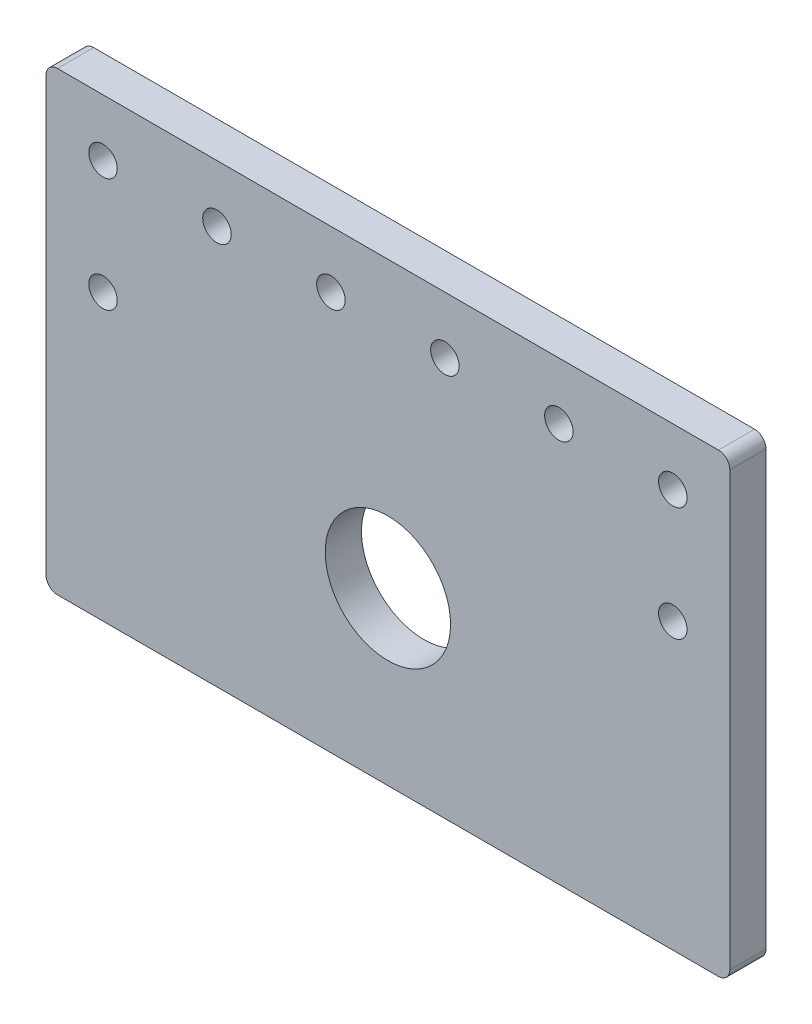
ISO-10303-21;
HEADER;
FILE_DESCRIPTION(('STEP AP214'),'2;1');
FILE_NAME('part.step','',(''),(''),'','','');
FILE_SCHEMA(('AUTOMOTIVE_DESIGN { 1 0 10303 214 1 1 1 1 }'));
ENDSEC;
DATA;
#1=APPLICATION_CONTEXT('core data for automotive mechanical design processes');
#2=APPLICATION_PROTOCOL_DEFINITION('international standard','automotive_design',2000,#1);
#3=PRODUCT_CONTEXT('',#1,'mechanical');
#4=PRODUCT('Part','Part','',(#3));
#5=PRODUCT_RELATED_PRODUCT_CATEGORY('part','',(#4));
#6=PRODUCT_DEFINITION_FORMATION('','',#4);
#7=PRODUCT_DEFINITION_CONTEXT('part definition',#1,'design');
#8=PRODUCT_DEFINITION('design','',#6,#7);
#9=PRODUCT_DEFINITION_SHAPE('','',#8);
#10=(LENGTH_UNIT() NAMED_UNIT(*) SI_UNIT(.MILLI.,.METRE.));
#11=(NAMED_UNIT(*) PLANE_ANGLE_UNIT() SI_UNIT($,.RADIAN.));
#12=(NAMED_UNIT(*) SI_UNIT($,.STERADIAN.) SOLID_ANGLE_UNIT());
#13=UNCERTAINTY_MEASURE_WITH_UNIT(LENGTH_MEASURE(1.E-05),#10,'distance_accuracy_value','');
#14=(GEOMETRIC_REPRESENTATION_CONTEXT(3) GLOBAL_UNCERTAINTY_ASSIGNED_CONTEXT((#13)) GLOBAL_UNIT_ASSIGNED_CONTEXT((#10,
#11,#12)) REPRESENTATION_CONTEXT('',''));
#15=CARTESIAN_POINT('',(0.,0.,0.));
#16=DIRECTION('',(0.,0.,1.));
#17=DIRECTION('',(1.,0.,0.));
#18=AXIS2_PLACEMENT_3D('',#15,#16,#17);
#19=CARTESIAN_POINT('',(0.,0.,6.35));
#20=DIRECTION('',(0.,0.,1.));
#21=DIRECTION('',(1.,0.,0.));
#22=AXIS2_PLACEMENT_3D('',#19,#20,#21);
#23=PLANE('',#22);
#24=CARTESIAN_POINT('',(50.0000000000002,10.,6.35));
#25=DIRECTION('',(0.,0.,1.));
#26=DIRECTION('',(1.,0.,0.));
#27=AXIS2_PLACEMENT_3D('',#24,#25,#26);
#28=CIRCLE('',#27,2.5);
#29=CARTESIAN_POINT('',(52.5000000000002,10.,6.35));
#30=VERTEX_POINT('',#29);
#31=EDGE_CURVE('E220',#30,#30,#28,.T.);
#32=ORIENTED_EDGE('',*,*,#31,.F.);
#33=EDGE_LOOP('',(#32));
#34=FACE_BOUND('',#33,.T.);
#35=CARTESIAN_POINT('',(50.,30.,6.35));
#36=DIRECTION('',(0.,0.,1.));
#37=DIRECTION('',(1.,0.,0.));
#38=AXIS2_PLACEMENT_3D('',#35,#36,#37);
#39=CIRCLE('',#38,2.5);
#40=CARTESIAN_POINT('',(52.5,30.,6.35));
#41=VERTEX_POINT('',#40);
#42=EDGE_CURVE('E208',#41,#41,#39,.T.);
#43=ORIENTED_EDGE('',*,*,#42,.F.);
#44=EDGE_LOOP('',(#43));
#45=FACE_BOUND('',#44,.T.);
#46=CARTESIAN_POINT('',(10.,30.,6.35));
#47=DIRECTION('',(0.,0.,1.));
#48=DIRECTION('',(1.,0.,0.));
#49=AXIS2_PLACEMENT_3D('',#46,#47,#48);
#50=CIRCLE('',#49,2.5);
#51=CARTESIAN_POINT('',(12.5,30.,6.35));
#52=VERTEX_POINT('',#51);
#53=EDGE_CURVE('E196',#52,#52,#50,.T.);
#54=ORIENTED_EDGE('',*,*,#53,.F.);
#55=EDGE_LOOP('',(#54));
#56=FACE_BOUND('',#55,.T.);
#57=CARTESIAN_POINT('',(-30.,30.,6.35));
#58=DIRECTION('',(0.,0.,1.));
#59=DIRECTION('',(1.,0.,0.));
#60=AXIS2_PLACEMENT_3D('',#57,#58,#59);
#61=CIRCLE('',#60,2.5);
#62=CARTESIAN_POINT('',(-27.5,30.,6.35));
#63=VERTEX_POINT('',#62);
#64=EDGE_CURVE('E185',#63,#63,#61,.T.);
#65=ORIENTED_EDGE('',*,*,#64,.F.);
#66=EDGE_LOOP('',(#65));
#67=FACE_BOUND('',#66,.T.);
#68=DIRECTION('',(1.,0.,0.));
#69=VECTOR('',#68,1.);
#70=CARTESIAN_POINT('',(-60.,-40.,6.35));
#71=LINE('',#70,#69);
#72=CARTESIAN_POINT('',(-58.,-40.,6.35));
#73=VERTEX_POINT('',#72);
#74=CARTESIAN_POINT('',(58.,-40.,6.35));
#75=VERTEX_POINT('',#74);
#76=EDGE_CURVE('E137',#73,#75,#71,.T.);
#77=ORIENTED_EDGE('',*,*,#76,.T.);
#78=CARTESIAN_POINT('',(58.,-38.,6.35));
#79=DIRECTION('',(0.,0.,1.));
#80=DIRECTION('',(1.,0.,0.));
#81=AXIS2_PLACEMENT_3D('',#78,#79,#80);
#82=CIRCLE('',#81,2.);
#83=CARTESIAN_POINT('',(60.,-38.,6.35));
#84=VERTEX_POINT('',#83);
#85=EDGE_CURVE('E155',#75,#84,#82,.T.);
#86=ORIENTED_EDGE('',*,*,#85,.T.);
#87=DIRECTION('',(0.,1.,0.));
#88=VECTOR('',#87,1.);
#89=CARTESIAN_POINT('',(60.,40.,6.35));
#90=LINE('',#89,#88);
#91=CARTESIAN_POINT('',(60.,38.,6.35));
#92=VERTEX_POINT('',#91);
#93=EDGE_CURVE('E119',#84,#92,#90,.T.);
#94=ORIENTED_EDGE('',*,*,#93,.T.);
#95=CARTESIAN_POINT('',(58.,38.,6.35));
#96=DIRECTION('',(0.,0.,1.));
#97=DIRECTION('',(1.,0.,0.));
#98=AXIS2_PLACEMENT_3D('',#95,#96,#97);
#99=CIRCLE('',#98,2.);
#100=CARTESIAN_POINT('',(58.,40.,6.35));
#101=VERTEX_POINT('',#100);
#102=EDGE_CURVE('E151',#92,#101,#99,.T.);
#103=ORIENTED_EDGE('',*,*,#102,.T.);
#104=DIRECTION('',(-1.,0.,0.));
#105=VECTOR('',#104,1.);
#106=CARTESIAN_POINT('',(-60.,40.,6.35));
#107=LINE('',#106,#105);
#108=CARTESIAN_POINT('',(-58.,40.,6.35));
#109=VERTEX_POINT('',#108);
#110=EDGE_CURVE('E164',#101,#109,#107,.T.);
#111=ORIENTED_EDGE('',*,*,#110,.T.);
#112=CARTESIAN_POINT('',(-58.,38.,6.35));
#113=DIRECTION('',(0.,0.,1.));
#114=DIRECTION('',(1.,0.,0.));
#115=AXIS2_PLACEMENT_3D('',#112,#113,#114);
#116=CIRCLE('',#115,2.);
#117=CARTESIAN_POINT('',(-60.,38.,6.35));
#118=VERTEX_POINT('',#117);
#119=EDGE_CURVE('E54',#109,#118,#116,.T.);
#120=ORIENTED_EDGE('',*,*,#119,.T.);
#121=DIRECTION('',(0.,-1.,0.));
#122=VECTOR('',#121,1.);
#123=CARTESIAN_POINT('',(-60.,40.,6.35));
#124=LINE('',#123,#122);
#125=CARTESIAN_POINT('',(-60.,-38.,6.35));
#126=VERTEX_POINT('',#125);
#127=EDGE_CURVE('E170',#118,#126,#124,.T.);
#128=ORIENTED_EDGE('',*,*,#127,.T.);
#129=CARTESIAN_POINT('',(-58.,-38.,6.35));
#130=DIRECTION('',(0.,0.,1.));
#131=DIRECTION('',(1.,0.,0.));
#132=AXIS2_PLACEMENT_3D('',#129,#130,#131);
#133=CIRCLE('',#132,2.);
#134=EDGE_CURVE('E153',#126,#73,#133,.T.);
#135=ORIENTED_EDGE('',*,*,#134,.T.);
#136=EDGE_LOOP('',(#77,#86,#94,#103,#111,#120,#128,#135));
#137=FACE_BOUND('',#136,.T.);
#138=CARTESIAN_POINT('',(-50.,30.,6.35));
#139=DIRECTION('',(0.,0.,1.));
#140=DIRECTION('',(1.,0.,0.));
#141=AXIS2_PLACEMENT_3D('',#138,#139,#140);
#142=CIRCLE('',#141,2.5);
#143=CARTESIAN_POINT('',(-47.5,30.,6.35));
#144=VERTEX_POINT('',#143);
#145=EDGE_CURVE('E128',#144,#144,#142,.T.);
#146=ORIENTED_EDGE('',*,*,#145,.F.);
#147=EDGE_LOOP('',(#146));
#148=FACE_BOUND('',#147,.T.);
#149=CARTESIAN_POINT('',(-9.99999999999997,30.,6.35));
#150=DIRECTION('',(0.,0.,1.));
#151=DIRECTION('',(1.,0.,0.));
#152=AXIS2_PLACEMENT_3D('',#149,#150,#151);
#153=CIRCLE('',#152,2.5);
#154=CARTESIAN_POINT('',(-7.49999999999997,30.,6.35));
#155=VERTEX_POINT('',#154);
#156=EDGE_CURVE('E190',#155,#155,#153,.T.);
#157=ORIENTED_EDGE('',*,*,#156,.F.);
#158=EDGE_LOOP('',(#157));
#159=FACE_BOUND('',#158,.T.);
#160=CARTESIAN_POINT('',(30.,30.,6.35));
#161=DIRECTION('',(0.,0.,1.));
#162=DIRECTION('',(1.,0.,0.));
#163=AXIS2_PLACEMENT_3D('',#160,#161,#162);
#164=CIRCLE('',#163,2.5);
#165=CARTESIAN_POINT('',(32.5,30.,6.35));
#166=VERTEX_POINT('',#165);
#167=EDGE_CURVE('E202',#166,#166,#164,.T.);
#168=ORIENTED_EDGE('',*,*,#167,.F.);
#169=EDGE_LOOP('',(#168));
#170=FACE_BOUND('',#169,.T.);
#171=CARTESIAN_POINT('',(-49.9999999999998,10.,6.35));
#172=DIRECTION('',(0.,0.,1.));
#173=DIRECTION('',(1.,0.,0.));
#174=AXIS2_PLACEMENT_3D('',#171,#172,#173);
#175=CIRCLE('',#174,2.5);
#176=CARTESIAN_POINT('',(-47.4999999999998,10.,6.35));
#177=VERTEX_POINT('',#176);
#178=EDGE_CURVE('E214',#177,#177,#175,.T.);
#179=ORIENTED_EDGE('',*,*,#178,.F.);
#180=EDGE_LOOP('',(#179));
#181=FACE_BOUND('',#180,.T.);
#182=CARTESIAN_POINT('',(0.,-10.,6.35));
#183=DIRECTION('',(0.,0.,1.));
#184=DIRECTION('',(1.,0.,0.));
#185=AXIS2_PLACEMENT_3D('',#182,#183,#184);
#186=CIRCLE('',#185,11.);
#187=CARTESIAN_POINT('',(11.,-10.,6.35));
#188=VERTEX_POINT('',#187);
#189=EDGE_CURVE('E226',#188,#188,#186,.T.);
#190=ORIENTED_EDGE('',*,*,#189,.F.);
#191=EDGE_LOOP('',(#190));
#192=FACE_BOUND('',#191,.T.);
#193=ADVANCED_FACE('F32',(#34,#45,#56,#67,#137,#148,#159,#170,#181,#192),#23,.T.);
#194=CARTESIAN_POINT('',(0.,0.,0.));
#195=DIRECTION('',(0.,0.,1.));
#196=DIRECTION('',(1.,0.,0.));
#197=AXIS2_PLACEMENT_3D('',#194,#195,#196);
#198=PLANE('',#197);
#199=DIRECTION('',(0.,1.,0.));
#200=VECTOR('',#199,1.);
#201=CARTESIAN_POINT('',(60.,40.,0.));
#202=LINE('',#201,#200);
#203=CARTESIAN_POINT('',(60.,-38.,0.));
#204=VERTEX_POINT('',#203);
#205=CARTESIAN_POINT('',(60.,38.,0.));
#206=VERTEX_POINT('',#205);
#207=EDGE_CURVE('E116',#204,#206,#202,.T.);
#208=ORIENTED_EDGE('',*,*,#207,.F.);
#209=CARTESIAN_POINT('',(58.,-38.,0.));
#210=DIRECTION('',(0.,0.,1.));
#211=DIRECTION('',(1.,0.,0.));
#212=AXIS2_PLACEMENT_3D('',#209,#210,#211);
#213=CIRCLE('',#212,2.);
#214=CARTESIAN_POINT('',(58.,-40.,0.));
#215=VERTEX_POINT('',#214);
#216=EDGE_CURVE('E99',#204,#215,#213,.F.);
#217=ORIENTED_EDGE('',*,*,#216,.T.);
#218=DIRECTION('',(1.,0.,0.));
#219=VECTOR('',#218,1.);
#220=CARTESIAN_POINT('',(-60.,-40.,0.));
#221=LINE('',#220,#219);
#222=CARTESIAN_POINT('',(-58.,-40.,0.));
#223=VERTEX_POINT('',#222);
#224=EDGE_CURVE('E141',#223,#215,#221,.T.);
#225=ORIENTED_EDGE('',*,*,#224,.F.);
#226=CARTESIAN_POINT('',(-58.,-38.,0.));
#227=DIRECTION('',(0.,0.,1.));
#228=DIRECTION('',(1.,0.,0.));
#229=AXIS2_PLACEMENT_3D('',#226,#227,#228);
#230=CIRCLE('',#229,2.);
#231=CARTESIAN_POINT('',(-60.,-38.,0.));
#232=VERTEX_POINT('',#231);
#233=EDGE_CURVE('E110',#223,#232,#230,.F.);
#234=ORIENTED_EDGE('',*,*,#233,.T.);
#235=DIRECTION('',(0.,-1.,0.));
#236=VECTOR('',#235,1.);
#237=CARTESIAN_POINT('',(-60.,40.,0.));
#238=LINE('',#237,#236);
#239=CARTESIAN_POINT('',(-60.,38.,0.));
#240=VERTEX_POINT('',#239);
#241=EDGE_CURVE('E131',#240,#232,#238,.T.);
#242=ORIENTED_EDGE('',*,*,#241,.F.);
#243=CARTESIAN_POINT('',(-58.,38.,0.));
#244=DIRECTION('',(0.,0.,1.));
#245=DIRECTION('',(1.,0.,0.));
#246=AXIS2_PLACEMENT_3D('',#243,#244,#245);
#247=CIRCLE('',#246,2.);
#248=CARTESIAN_POINT('',(-58.,40.,0.));
#249=VERTEX_POINT('',#248);
#250=EDGE_CURVE('E120',#240,#249,#247,.F.);
#251=ORIENTED_EDGE('',*,*,#250,.T.);
#252=DIRECTION('',(-1.,0.,0.));
#253=VECTOR('',#252,1.);
#254=CARTESIAN_POINT('',(-60.,40.,0.));
#255=LINE('',#254,#253);
#256=CARTESIAN_POINT('',(58.,40.,0.));
#257=VERTEX_POINT('',#256);
#258=EDGE_CURVE('E127',#257,#249,#255,.T.);
#259=ORIENTED_EDGE('',*,*,#258,.F.);
#260=CARTESIAN_POINT('',(58.,38.,0.));
#261=DIRECTION('',(0.,0.,1.));
#262=DIRECTION('',(1.,0.,0.));
#263=AXIS2_PLACEMENT_3D('',#260,#261,#262);
#264=CIRCLE('',#263,2.);
#265=EDGE_CURVE('E126',#257,#206,#264,.F.);
#266=ORIENTED_EDGE('',*,*,#265,.T.);
#267=EDGE_LOOP('',(#208,#217,#225,#234,#242,#251,#259,#266));
#268=FACE_BOUND('',#267,.T.);
#269=CARTESIAN_POINT('',(-50.,30.,0.));
#270=DIRECTION('',(0.,0.,1.));
#271=DIRECTION('',(1.,0.,0.));
#272=AXIS2_PLACEMENT_3D('',#269,#270,#271);
#273=CIRCLE('',#272,2.5);
#274=CARTESIAN_POINT('',(-47.5,30.,0.));
#275=VERTEX_POINT('',#274);
#276=EDGE_CURVE('E134',#275,#275,#273,.T.);
#277=ORIENTED_EDGE('',*,*,#276,.T.);
#278=EDGE_LOOP('',(#277));
#279=FACE_BOUND('',#278,.T.);
#280=CARTESIAN_POINT('',(-30.,30.,0.));
#281=DIRECTION('',(0.,0.,1.));
#282=DIRECTION('',(1.,0.,0.));
#283=AXIS2_PLACEMENT_3D('',#280,#281,#282);
#284=CIRCLE('',#283,2.5);
#285=CARTESIAN_POINT('',(-27.5,30.,0.));
#286=VERTEX_POINT('',#285);
#287=EDGE_CURVE('E187',#286,#286,#284,.T.);
#288=ORIENTED_EDGE('',*,*,#287,.T.);
#289=EDGE_LOOP('',(#288));
#290=FACE_BOUND('',#289,.T.);
#291=CARTESIAN_POINT('',(-9.99999999999997,30.,0.));
#292=DIRECTION('',(0.,0.,1.));
#293=DIRECTION('',(1.,0.,0.));
#294=AXIS2_PLACEMENT_3D('',#291,#292,#293);
#295=CIRCLE('',#294,2.5);
#296=CARTESIAN_POINT('',(-7.49999999999997,30.,0.));
#297=VERTEX_POINT('',#296);
#298=EDGE_CURVE('E193',#297,#297,#295,.T.);
#299=ORIENTED_EDGE('',*,*,#298,.T.);
#300=EDGE_LOOP('',(#299));
#301=FACE_BOUND('',#300,.T.);
#302=CARTESIAN_POINT('',(10.,30.,0.));
#303=DIRECTION('',(0.,0.,1.));
#304=DIRECTION('',(1.,0.,0.));
#305=AXIS2_PLACEMENT_3D('',#302,#303,#304);
#306=CIRCLE('',#305,2.5);
#307=CARTESIAN_POINT('',(12.5,30.,0.));
#308=VERTEX_POINT('',#307);
#309=EDGE_CURVE('E199',#308,#308,#306,.T.);
#310=ORIENTED_EDGE('',*,*,#309,.T.);
#311=EDGE_LOOP('',(#310));
#312=FACE_BOUND('',#311,.T.);
#313=CARTESIAN_POINT('',(30.,30.,0.));
#314=DIRECTION('',(0.,0.,1.));
#315=DIRECTION('',(1.,0.,0.));
#316=AXIS2_PLACEMENT_3D('',#313,#314,#315);
#317=CIRCLE('',#316,2.5);
#318=CARTESIAN_POINT('',(32.5,30.,0.));
#319=VERTEX_POINT('',#318);
#320=EDGE_CURVE('E205',#319,#319,#317,.T.);
#321=ORIENTED_EDGE('',*,*,#320,.T.);
#322=EDGE_LOOP('',(#321));
#323=FACE_BOUND('',#322,.T.);
#324=CARTESIAN_POINT('',(50.,30.,0.));
#325=DIRECTION('',(0.,0.,1.));
#326=DIRECTION('',(1.,0.,0.));
#327=AXIS2_PLACEMENT_3D('',#324,#325,#326);
#328=CIRCLE('',#327,2.5);
#329=CARTESIAN_POINT('',(52.5,30.,0.));
#330=VERTEX_POINT('',#329);
#331=EDGE_CURVE('E211',#330,#330,#328,.T.);
#332=ORIENTED_EDGE('',*,*,#331,.T.);
#333=EDGE_LOOP('',(#332));
#334=FACE_BOUND('',#333,.T.);
#335=CARTESIAN_POINT('',(-49.9999999999998,10.,0.));
#336=DIRECTION('',(0.,0.,1.));
#337=DIRECTION('',(1.,0.,0.));
#338=AXIS2_PLACEMENT_3D('',#335,#336,#337);
#339=CIRCLE('',#338,2.5);
#340=CARTESIAN_POINT('',(-47.4999999999998,10.,0.));
#341=VERTEX_POINT('',#340);
#342=EDGE_CURVE('E217',#341,#341,#339,.T.);
#343=ORIENTED_EDGE('',*,*,#342,.T.);
#344=EDGE_LOOP('',(#343));
#345=FACE_BOUND('',#344,.T.);
#346=CARTESIAN_POINT('',(50.0000000000002,10.,0.));
#347=DIRECTION('',(0.,0.,1.));
#348=DIRECTION('',(1.,0.,0.));
#349=AXIS2_PLACEMENT_3D('',#346,#347,#348);
#350=CIRCLE('',#349,2.5);
#351=CARTESIAN_POINT('',(52.5000000000002,10.,0.));
#352=VERTEX_POINT('',#351);
#353=EDGE_CURVE('E223',#352,#352,#350,.T.);
#354=ORIENTED_EDGE('',*,*,#353,.T.);
#355=EDGE_LOOP('',(#354));
#356=FACE_BOUND('',#355,.T.);
#357=CARTESIAN_POINT('',(0.,-10.,0.));
#358=DIRECTION('',(0.,0.,1.));
#359=DIRECTION('',(1.,0.,0.));
#360=AXIS2_PLACEMENT_3D('',#357,#358,#359);
#361=CIRCLE('',#360,11.);
#362=CARTESIAN_POINT('',(11.,-10.,0.));
#363=VERTEX_POINT('',#362);
#364=EDGE_CURVE('E229',#363,#363,#361,.T.);
#365=ORIENTED_EDGE('',*,*,#364,.T.);
#366=EDGE_LOOP('',(#365));
#367=FACE_BOUND('',#366,.T.);
#368=ADVANCED_FACE('F123',(#268,#279,#290,#301,#312,#323,#334,#345,#356,#367),#198,.F.);
#369=CARTESIAN_POINT('',(60.,40.,6.35));
#370=DIRECTION('',(-1.,0.,0.));
#371=DIRECTION('',(0.,-1.,0.));
#372=AXIS2_PLACEMENT_3D('',#369,#370,#371);
#373=PLANE('',#372);
#374=ORIENTED_EDGE('',*,*,#93,.F.);
#375=DIRECTION('',(0.,0.,-1.));
#376=VECTOR('',#375,1.);
#377=CARTESIAN_POINT('',(60.,-38.,6.35));
#378=LINE('',#377,#376);
#379=EDGE_CURVE('E103',#84,#204,#378,.T.);
#380=ORIENTED_EDGE('',*,*,#379,.T.);
#381=ORIENTED_EDGE('',*,*,#207,.T.);
#382=DIRECTION('',(0.,0.,-1.));
#383=VECTOR('',#382,1.);
#384=CARTESIAN_POINT('',(60.,38.,6.35));
#385=LINE('',#384,#383);
#386=EDGE_CURVE('E121',#206,#92,#385,.F.);
#387=ORIENTED_EDGE('',*,*,#386,.T.);
#388=EDGE_LOOP('',(#374,#380,#381,#387));
#389=FACE_BOUND('',#388,.T.);
#390=ADVANCED_FACE('F115',(#389),#373,.F.);
#391=CARTESIAN_POINT('',(-60.,40.,6.35));
#392=DIRECTION('',(0.,-1.,0.));
#393=DIRECTION('',(0.,0.,-1.));
#394=AXIS2_PLACEMENT_3D('',#391,#392,#393);
#395=PLANE('',#394);
#396=ORIENTED_EDGE('',*,*,#110,.F.);
#397=DIRECTION('',(0.,0.,-1.));
#398=VECTOR('',#397,1.);
#399=CARTESIAN_POINT('',(58.,40.,6.35));
#400=LINE('',#399,#398);
#401=EDGE_CURVE('E11',#101,#257,#400,.T.);
#402=ORIENTED_EDGE('',*,*,#401,.T.);
#403=ORIENTED_EDGE('',*,*,#258,.T.);
#404=DIRECTION('',(0.,0.,-1.));
#405=VECTOR('',#404,1.);
#406=CARTESIAN_POINT('',(-58.,40.,6.35));
#407=LINE('',#406,#405);
#408=EDGE_CURVE('E40',#249,#109,#407,.F.);
#409=ORIENTED_EDGE('',*,*,#408,.T.);
#410=EDGE_LOOP('',(#396,#402,#403,#409));
#411=FACE_BOUND('',#410,.T.);
#412=ADVANCED_FACE('F163',(#411),#395,.F.);
#413=CARTESIAN_POINT('',(-60.,40.,6.35));
#414=DIRECTION('',(1.,0.,0.));
#415=DIRECTION('',(0.,1.,0.));
#416=AXIS2_PLACEMENT_3D('',#413,#414,#415);
#417=PLANE('',#416);
#418=ORIENTED_EDGE('',*,*,#241,.T.);
#419=DIRECTION('',(0.,0.,-1.));
#420=VECTOR('',#419,1.);
#421=CARTESIAN_POINT('',(-60.,-38.,6.35));
#422=LINE('',#421,#420);
#423=EDGE_CURVE('E47',#232,#126,#422,.F.);
#424=ORIENTED_EDGE('',*,*,#423,.T.);
#425=ORIENTED_EDGE('',*,*,#127,.F.);
#426=DIRECTION('',(0.,0.,-1.));
#427=VECTOR('',#426,1.);
#428=CARTESIAN_POINT('',(-60.,38.,6.35));
#429=LINE('',#428,#427);
#430=EDGE_CURVE('E157',#118,#240,#429,.T.);
#431=ORIENTED_EDGE('',*,*,#430,.T.);
#432=EDGE_LOOP('',(#418,#424,#425,#431));
#433=FACE_BOUND('',#432,.T.);
#434=ADVANCED_FACE('F174',(#433),#417,.F.);
#435=CARTESIAN_POINT('',(-60.,-40.,6.35));
#436=DIRECTION('',(0.,1.,0.));
#437=DIRECTION('',(0.,0.,1.));
#438=AXIS2_PLACEMENT_3D('',#435,#436,#437);
#439=PLANE('',#438);
#440=ORIENTED_EDGE('',*,*,#224,.T.);
#441=DIRECTION('',(0.,0.,-1.));
#442=VECTOR('',#441,1.);
#443=CARTESIAN_POINT('',(58.,-40.,6.35));
#444=LINE('',#443,#442);
#445=EDGE_CURVE('E104',#215,#75,#444,.F.);
#446=ORIENTED_EDGE('',*,*,#445,.T.);
#447=ORIENTED_EDGE('',*,*,#76,.F.);
#448=DIRECTION('',(0.,0.,-1.));
#449=VECTOR('',#448,1.);
#450=CARTESIAN_POINT('',(-58.,-40.,6.35));
#451=LINE('',#450,#449);
#452=EDGE_CURVE('E109',#73,#223,#451,.T.);
#453=ORIENTED_EDGE('',*,*,#452,.T.);
#454=EDGE_LOOP('',(#440,#446,#447,#453));
#455=FACE_BOUND('',#454,.T.);
#456=ADVANCED_FACE('F181',(#455),#439,.F.);
#457=CARTESIAN_POINT('',(-50.,30.,6.35));
#458=DIRECTION('',(0.,0.,-1.));
#459=DIRECTION('',(-1.,0.,0.));
#460=AXIS2_PLACEMENT_3D('',#457,#458,#459);
#461=CYLINDRICAL_SURFACE('',#460,2.5);
#462=ORIENTED_EDGE('',*,*,#145,.T.);
#463=EDGE_LOOP('',(#462));
#464=FACE_BOUND('',#463,.T.);
#465=ORIENTED_EDGE('',*,*,#276,.F.);
#466=EDGE_LOOP('',(#465));
#467=FACE_BOUND('',#466,.T.);
#468=ADVANCED_FACE('F248',(#464,#467),#461,.F.);
#469=CARTESIAN_POINT('',(-30.,30.,6.35));
#470=DIRECTION('',(0.,0.,-1.));
#471=DIRECTION('',(-1.,0.,0.));
#472=AXIS2_PLACEMENT_3D('',#469,#470,#471);
#473=CYLINDRICAL_SURFACE('',#472,2.5);
#474=ORIENTED_EDGE('',*,*,#64,.T.);
#475=EDGE_LOOP('',(#474));
#476=FACE_BOUND('',#475,.T.);
#477=ORIENTED_EDGE('',*,*,#287,.F.);
#478=EDGE_LOOP('',(#477));
#479=FACE_BOUND('',#478,.T.);
#480=ADVANCED_FACE('F390',(#476,#479),#473,.F.);
#481=CARTESIAN_POINT('',(-9.99999999999997,30.,6.35));
#482=DIRECTION('',(0.,0.,-1.));
#483=DIRECTION('',(-1.,0.,0.));
#484=AXIS2_PLACEMENT_3D('',#481,#482,#483);
#485=CYLINDRICAL_SURFACE('',#484,2.5);
#486=ORIENTED_EDGE('',*,*,#156,.T.);
#487=EDGE_LOOP('',(#486));
#488=FACE_BOUND('',#487,.T.);
#489=ORIENTED_EDGE('',*,*,#298,.F.);
#490=EDGE_LOOP('',(#489));
#491=FACE_BOUND('',#490,.T.);
#492=ADVANCED_FACE('F380',(#488,#491),#485,.F.);
#493=CARTESIAN_POINT('',(10.,30.,6.35));
#494=DIRECTION('',(0.,0.,-1.));
#495=DIRECTION('',(-1.,0.,0.));
#496=AXIS2_PLACEMENT_3D('',#493,#494,#495);
#497=CYLINDRICAL_SURFACE('',#496,2.5);
#498=ORIENTED_EDGE('',*,*,#53,.T.);
#499=EDGE_LOOP('',(#498));
#500=FACE_BOUND('',#499,.T.);
#501=ORIENTED_EDGE('',*,*,#309,.F.);
#502=EDGE_LOOP('',(#501));
#503=FACE_BOUND('',#502,.T.);
#504=ADVANCED_FACE('F370',(#500,#503),#497,.F.);
#505=CARTESIAN_POINT('',(30.,30.,6.35));
#506=DIRECTION('',(0.,0.,-1.));
#507=DIRECTION('',(-1.,0.,0.));
#508=AXIS2_PLACEMENT_3D('',#505,#506,#507);
#509=CYLINDRICAL_SURFACE('',#508,2.5);
#510=ORIENTED_EDGE('',*,*,#167,.T.);
#511=EDGE_LOOP('',(#510));
#512=FACE_BOUND('',#511,.T.);
#513=ORIENTED_EDGE('',*,*,#320,.F.);
#514=EDGE_LOOP('',(#513));
#515=FACE_BOUND('',#514,.T.);
#516=ADVANCED_FACE('F360',(#512,#515),#509,.F.);
#517=CARTESIAN_POINT('',(50.,30.,6.35));
#518=DIRECTION('',(0.,0.,-1.));
#519=DIRECTION('',(-1.,0.,0.));
#520=AXIS2_PLACEMENT_3D('',#517,#518,#519);
#521=CYLINDRICAL_SURFACE('',#520,2.5);
#522=ORIENTED_EDGE('',*,*,#42,.T.);
#523=EDGE_LOOP('',(#522));
#524=FACE_BOUND('',#523,.T.);
#525=ORIENTED_EDGE('',*,*,#331,.F.);
#526=EDGE_LOOP('',(#525));
#527=FACE_BOUND('',#526,.T.);
#528=ADVANCED_FACE('F350',(#524,#527),#521,.F.);
#529=CARTESIAN_POINT('',(-49.9999999999998,10.,6.35));
#530=DIRECTION('',(0.,0.,-1.));
#531=DIRECTION('',(-1.,0.,0.));
#532=AXIS2_PLACEMENT_3D('',#529,#530,#531);
#533=CYLINDRICAL_SURFACE('',#532,2.5);
#534=ORIENTED_EDGE('',*,*,#178,.T.);
#535=EDGE_LOOP('',(#534));
#536=FACE_BOUND('',#535,.T.);
#537=ORIENTED_EDGE('',*,*,#342,.F.);
#538=EDGE_LOOP('',(#537));
#539=FACE_BOUND('',#538,.T.);
#540=ADVANCED_FACE('F340',(#536,#539),#533,.F.);
#541=CARTESIAN_POINT('',(50.0000000000002,10.,6.35));
#542=DIRECTION('',(0.,0.,-1.));
#543=DIRECTION('',(-1.,0.,0.));
#544=AXIS2_PLACEMENT_3D('',#541,#542,#543);
#545=CYLINDRICAL_SURFACE('',#544,2.5);
#546=ORIENTED_EDGE('',*,*,#31,.T.);
#547=EDGE_LOOP('',(#546));
#548=FACE_BOUND('',#547,.T.);
#549=ORIENTED_EDGE('',*,*,#353,.F.);
#550=EDGE_LOOP('',(#549));
#551=FACE_BOUND('',#550,.T.);
#552=ADVANCED_FACE('F331',(#548,#551),#545,.F.);
#553=CARTESIAN_POINT('',(0.,-10.,6.35));
#554=DIRECTION('',(0.,0.,-1.));
#555=DIRECTION('',(-1.,0.,0.));
#556=AXIS2_PLACEMENT_3D('',#553,#554,#555);
#557=CYLINDRICAL_SURFACE('',#556,11.);
#558=ORIENTED_EDGE('',*,*,#189,.T.);
#559=EDGE_LOOP('',(#558));
#560=FACE_BOUND('',#559,.T.);
#561=ORIENTED_EDGE('',*,*,#364,.F.);
#562=EDGE_LOOP('',(#561));
#563=FACE_BOUND('',#562,.T.);
#564=ADVANCED_FACE('F235',(#560,#563),#557,.F.);
#565=CARTESIAN_POINT('',(58.,-38.,6.35));
#566=DIRECTION('',(0.,0.,-1.));
#567=DIRECTION('',(-1.,0.,0.));
#568=AXIS2_PLACEMENT_3D('',#565,#566,#567);
#569=CYLINDRICAL_SURFACE('',#568,2.);
#570=ORIENTED_EDGE('',*,*,#85,.F.);
#571=ORIENTED_EDGE('',*,*,#445,.F.);
#572=ORIENTED_EDGE('',*,*,#216,.F.);
#573=ORIENTED_EDGE('',*,*,#379,.F.);
#574=EDGE_LOOP('',(#570,#571,#572,#573));
#575=FACE_BOUND('',#574,.T.);
#576=ADVANCED_FACE('F102',(#575),#569,.T.);
#577=CARTESIAN_POINT('',(-58.,-38.,6.35));
#578=DIRECTION('',(0.,0.,-1.));
#579=DIRECTION('',(-1.,0.,0.));
#580=AXIS2_PLACEMENT_3D('',#577,#578,#579);
#581=CYLINDRICAL_SURFACE('',#580,2.);
#582=ORIENTED_EDGE('',*,*,#134,.F.);
#583=ORIENTED_EDGE('',*,*,#423,.F.);
#584=ORIENTED_EDGE('',*,*,#233,.F.);
#585=ORIENTED_EDGE('',*,*,#452,.F.);
#586=EDGE_LOOP('',(#582,#583,#584,#585));
#587=FACE_BOUND('',#586,.T.);
#588=ADVANCED_FACE('F178',(#587),#581,.T.);
#589=CARTESIAN_POINT('',(58.,38.,6.35));
#590=DIRECTION('',(0.,0.,-1.));
#591=DIRECTION('',(-1.,0.,0.));
#592=AXIS2_PLACEMENT_3D('',#589,#590,#591);
#593=CYLINDRICAL_SURFACE('',#592,2.);
#594=ORIENTED_EDGE('',*,*,#102,.F.);
#595=ORIENTED_EDGE('',*,*,#386,.F.);
#596=ORIENTED_EDGE('',*,*,#265,.F.);
#597=ORIENTED_EDGE('',*,*,#401,.F.);
#598=EDGE_LOOP('',(#594,#595,#596,#597));
#599=FACE_BOUND('',#598,.T.);
#600=ADVANCED_FACE('F262',(#599),#593,.T.);
#601=CARTESIAN_POINT('',(-58.,38.,6.35));
#602=DIRECTION('',(0.,0.,-1.));
#603=DIRECTION('',(-1.,0.,0.));
#604=AXIS2_PLACEMENT_3D('',#601,#602,#603);
#605=CYLINDRICAL_SURFACE('',#604,2.);
#606=ORIENTED_EDGE('',*,*,#119,.F.);
#607=ORIENTED_EDGE('',*,*,#408,.F.);
#608=ORIENTED_EDGE('',*,*,#250,.F.);
#609=ORIENTED_EDGE('',*,*,#430,.F.);
#610=EDGE_LOOP('',(#606,#607,#608,#609));
#611=FACE_BOUND('',#610,.T.);
#612=ADVANCED_FACE('F34',(#611),#605,.T.);
#613=CLOSED_SHELL('',(#193,#368,#390,#412,#434,#456,#468,#480,#492,#504,#516,#528,#540,#552,
#564,#576,#588,#600,#612));
#614=MANIFOLD_SOLID_BREP('B2',#613);
#615=ADVANCED_BREP_SHAPE_REPRESENTATION('',(#18,#614),#14);
#616=SHAPE_DEFINITION_REPRESENTATION(#9,#615);
ENDSEC;
END-ISO-10303-21;
